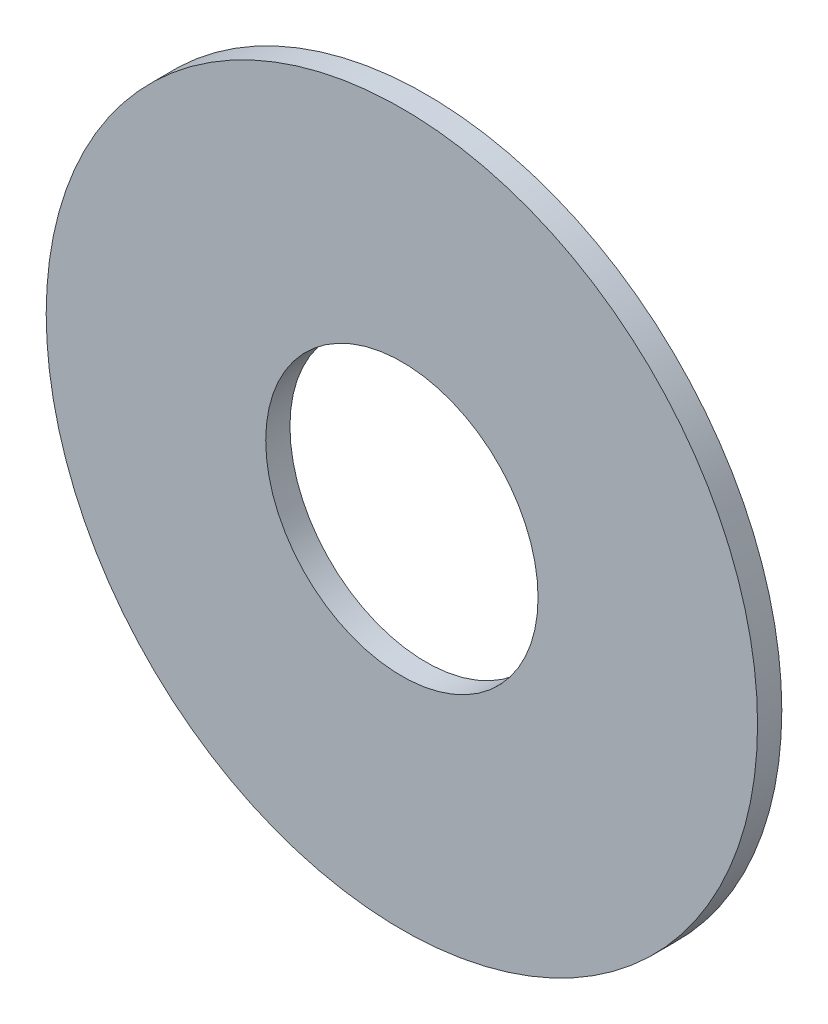
ISO-10303-21;
HEADER;
FILE_DESCRIPTION(('STEP AP214'),'2;1');
FILE_NAME('part.step','',(''),(''),'','','');
FILE_SCHEMA(('AUTOMOTIVE_DESIGN { 1 0 10303 214 1 1 1 1 }'));
ENDSEC;
DATA;
#1=APPLICATION_CONTEXT('core data for automotive mechanical design processes');
#2=APPLICATION_PROTOCOL_DEFINITION('international standard','automotive_design',2000,#1);
#3=PRODUCT_CONTEXT('',#1,'mechanical');
#4=PRODUCT('Part','Part','',(#3));
#5=PRODUCT_RELATED_PRODUCT_CATEGORY('part','',(#4));
#6=PRODUCT_DEFINITION_FORMATION('','',#4);
#7=PRODUCT_DEFINITION_CONTEXT('part definition',#1,'design');
#8=PRODUCT_DEFINITION('design','',#6,#7);
#9=PRODUCT_DEFINITION_SHAPE('','',#8);
#10=(LENGTH_UNIT() NAMED_UNIT(*) SI_UNIT(.MILLI.,.METRE.));
#11=(NAMED_UNIT(*) PLANE_ANGLE_UNIT() SI_UNIT($,.RADIAN.));
#12=(NAMED_UNIT(*) SI_UNIT($,.STERADIAN.) SOLID_ANGLE_UNIT());
#13=UNCERTAINTY_MEASURE_WITH_UNIT(LENGTH_MEASURE(1.E-05),#10,'distance_accuracy_value','');
#14=(GEOMETRIC_REPRESENTATION_CONTEXT(3) GLOBAL_UNCERTAINTY_ASSIGNED_CONTEXT((#13)) GLOBAL_UNIT_ASSIGNED_CONTEXT((#10,
#11,#12)) REPRESENTATION_CONTEXT('',''));
#15=CARTESIAN_POINT('',(0.,0.,0.));
#16=DIRECTION('',(0.,0.,1.));
#17=DIRECTION('',(1.,0.,0.));
#18=AXIS2_PLACEMENT_3D('',#15,#16,#17);
#19=CARTESIAN_POINT('',(0.,0.,0.317499999999998));
#20=DIRECTION('',(0.,0.,1.));
#21=DIRECTION('',(1.,0.,0.));
#22=AXIS2_PLACEMENT_3D('',#19,#20,#21);
#23=PLANE('',#22);
#24=CARTESIAN_POINT('',(0.,0.,0.317499999999998));
#25=DIRECTION('',(0.,0.,1.));
#26=DIRECTION('',(1.,0.,0.));
#27=AXIS2_PLACEMENT_3D('',#24,#25,#26);
#28=CIRCLE('',#27,9.3218);
#29=CARTESIAN_POINT('',(9.3218,0.,0.317499999999998));
#30=VERTEX_POINT('',#29);
#31=EDGE_CURVE('E10',#30,#30,#28,.T.);
#32=ORIENTED_EDGE('',*,*,#31,.T.);
#33=EDGE_LOOP('',(#32));
#34=FACE_BOUND('',#33,.T.);
#35=CARTESIAN_POINT('',(0.,0.,0.317499999999998));
#36=DIRECTION('',(0.,0.,1.));
#37=DIRECTION('',(1.,0.,0.));
#38=AXIS2_PLACEMENT_3D('',#35,#36,#37);
#39=CIRCLE('',#38,3.5687);
#40=CARTESIAN_POINT('',(3.5687,0.,0.317499999999998));
#41=VERTEX_POINT('',#40);
#42=EDGE_CURVE('E49',#41,#41,#39,.T.);
#43=ORIENTED_EDGE('',*,*,#42,.F.);
#44=EDGE_LOOP('',(#43));
#45=FACE_BOUND('',#44,.T.);
#46=ADVANCED_FACE('F41',(#34,#45),#23,.T.);
#47=CARTESIAN_POINT('',(0.,0.,0.317499999999998));
#48=DIRECTION('',(0.,0.,-1.));
#49=DIRECTION('',(-1.,0.,0.));
#50=AXIS2_PLACEMENT_3D('',#47,#48,#49);
#51=CYLINDRICAL_SURFACE('',#50,9.3218);
#52=ORIENTED_EDGE('',*,*,#31,.F.);
#53=EDGE_LOOP('',(#52));
#54=FACE_BOUND('',#53,.T.);
#55=CARTESIAN_POINT('',(0.,0.,-0.317500000000002));
#56=DIRECTION('',(0.,0.,1.));
#57=DIRECTION('',(1.,0.,0.));
#58=AXIS2_PLACEMENT_3D('',#55,#56,#57);
#59=CIRCLE('',#58,9.3218);
#60=CARTESIAN_POINT('',(9.3218,0.,-0.317500000000002));
#61=VERTEX_POINT('',#60);
#62=EDGE_CURVE('E54',#61,#61,#59,.T.);
#63=ORIENTED_EDGE('',*,*,#62,.T.);
#64=EDGE_LOOP('',(#63));
#65=FACE_BOUND('',#64,.T.);
#66=ADVANCED_FACE('F43',(#54,#65),#51,.T.);
#67=CARTESIAN_POINT('',(0.,0.,0.317499999999998));
#68=DIRECTION('',(0.,0.,-1.));
#69=DIRECTION('',(-1.,0.,0.));
#70=AXIS2_PLACEMENT_3D('',#67,#68,#69);
#71=CYLINDRICAL_SURFACE('',#70,3.5687);
#72=ORIENTED_EDGE('',*,*,#42,.T.);
#73=EDGE_LOOP('',(#72));
#74=FACE_BOUND('',#73,.T.);
#75=CARTESIAN_POINT('',(0.,0.,-0.317500000000002));
#76=DIRECTION('',(0.,0.,1.));
#77=DIRECTION('',(1.,0.,0.));
#78=AXIS2_PLACEMENT_3D('',#75,#76,#77);
#79=CIRCLE('',#78,3.5687);
#80=CARTESIAN_POINT('',(3.5687,0.,-0.317500000000002));
#81=VERTEX_POINT('',#80);
#82=EDGE_CURVE('E59',#81,#81,#79,.T.);
#83=ORIENTED_EDGE('',*,*,#82,.F.);
#84=EDGE_LOOP('',(#83));
#85=FACE_BOUND('',#84,.T.);
#86=ADVANCED_FACE('F69',(#74,#85),#71,.F.);
#87=CARTESIAN_POINT('',(0.,0.,-0.317500000000002));
#88=DIRECTION('',(0.,0.,1.));
#89=DIRECTION('',(1.,0.,0.));
#90=AXIS2_PLACEMENT_3D('',#87,#88,#89);
#91=PLANE('',#90);
#92=ORIENTED_EDGE('',*,*,#82,.T.);
#93=EDGE_LOOP('',(#92));
#94=FACE_BOUND('',#93,.T.);
#95=ORIENTED_EDGE('',*,*,#62,.F.);
#96=EDGE_LOOP('',(#95));
#97=FACE_BOUND('',#96,.T.);
#98=ADVANCED_FACE('F66',(#94,#97),#91,.F.);
#99=CLOSED_SHELL('',(#46,#66,#86,#98));
#100=MANIFOLD_SOLID_BREP('B2',#99);
#101=ADVANCED_BREP_SHAPE_REPRESENTATION('',(#18,#100),#14);
#102=SHAPE_DEFINITION_REPRESENTATION(#9,#101);
ENDSEC;
END-ISO-10303-21;
